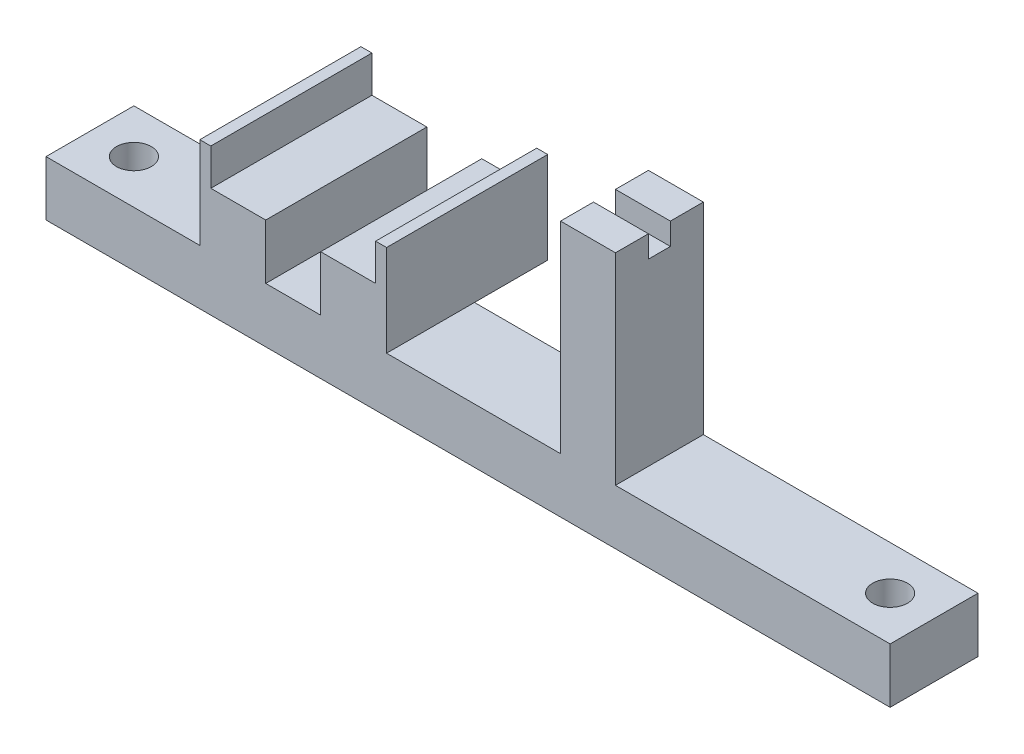
ISO-10303-21;
HEADER;
FILE_DESCRIPTION(('STEP AP214'),'2;1');
FILE_NAME('part.step','',(''),(''),'','','');
FILE_SCHEMA(('AUTOMOTIVE_DESIGN { 1 0 10303 214 1 1 1 1 }'));
ENDSEC;
DATA;
#1=APPLICATION_CONTEXT('core data for automotive mechanical design processes');
#2=APPLICATION_PROTOCOL_DEFINITION('international standard','automotive_design',2000,#1);
#3=PRODUCT_CONTEXT('',#1,'mechanical');
#4=PRODUCT('Part','Part','',(#3));
#5=PRODUCT_RELATED_PRODUCT_CATEGORY('part','',(#4));
#6=PRODUCT_DEFINITION_FORMATION('','',#4);
#7=PRODUCT_DEFINITION_CONTEXT('part definition',#1,'design');
#8=PRODUCT_DEFINITION('design','',#6,#7);
#9=PRODUCT_DEFINITION_SHAPE('','',#8);
#10=(LENGTH_UNIT() NAMED_UNIT(*) SI_UNIT(.MILLI.,.METRE.));
#11=(NAMED_UNIT(*) PLANE_ANGLE_UNIT() SI_UNIT($,.RADIAN.));
#12=(NAMED_UNIT(*) SI_UNIT($,.STERADIAN.) SOLID_ANGLE_UNIT());
#13=UNCERTAINTY_MEASURE_WITH_UNIT(LENGTH_MEASURE(1.E-05),#10,'distance_accuracy_value','');
#14=(GEOMETRIC_REPRESENTATION_CONTEXT(3) GLOBAL_UNCERTAINTY_ASSIGNED_CONTEXT((#13)) GLOBAL_UNIT_ASSIGNED_CONTEXT((#10,
#11,#12)) REPRESENTATION_CONTEXT('',''));
#15=CARTESIAN_POINT('',(0.,0.,0.));
#16=DIRECTION('',(0.,0.,1.));
#17=DIRECTION('',(1.,0.,0.));
#18=AXIS2_PLACEMENT_3D('',#15,#16,#17);
#19=CARTESIAN_POINT('',(0.,30.,0.));
#20=DIRECTION('',(0.,1.,0.));
#21=DIRECTION('',(0.,0.,1.));
#22=AXIS2_PLACEMENT_3D('',#19,#20,#21);
#23=PLANE('',#22);
#24=DIRECTION('',(1.,0.,0.));
#25=VECTOR('',#24,1.);
#26=CARTESIAN_POINT('',(-18.7314340588988,30.,-23.1962227912932));
#27=LINE('',#26,#25);
#28=CARTESIAN_POINT('',(-18.7314340588988,30.,-23.1962227912932));
#29=VERTEX_POINT('',#28);
#30=CARTESIAN_POINT('',(-3.73143405889884,30.,-23.1962227912932));
#31=VERTEX_POINT('',#30);
#32=EDGE_CURVE('E69',#29,#31,#27,.T.);
#33=ORIENTED_EDGE('',*,*,#32,.T.);
#34=DIRECTION('',(0.,0.,1.));
#35=VECTOR('',#34,1.);
#36=CARTESIAN_POINT('',(-3.73143405889885,30.,-67.1962227912932));
#37=LINE('',#36,#35);
#38=CARTESIAN_POINT('',(-3.73143405889885,30.,-67.1962227912932));
#39=VERTEX_POINT('',#38);
#40=EDGE_CURVE('E64',#39,#31,#37,.T.);
#41=ORIENTED_EDGE('',*,*,#40,.F.);
#42=DIRECTION('',(-1.,0.,0.));
#43=VECTOR('',#42,1.);
#44=CARTESIAN_POINT('',(-18.7314340588988,30.,-67.1962227912932));
#45=LINE('',#44,#43);
#46=CARTESIAN_POINT('',(-18.7314340588988,30.,-67.1962227912932));
#47=VERTEX_POINT('',#46);
#48=EDGE_CURVE('E416',#39,#47,#45,.T.);
#49=ORIENTED_EDGE('',*,*,#48,.T.);
#50=DIRECTION('',(0.,0.,1.));
#51=VECTOR('',#50,1.);
#52=CARTESIAN_POINT('',(-18.7314340588988,30.,-67.1962227912932));
#53=LINE('',#52,#51);
#54=EDGE_CURVE('E421',#47,#29,#53,.T.);
#55=ORIENTED_EDGE('',*,*,#54,.T.);
#56=EDGE_LOOP('',(#33,#41,#49,#55));
#57=FACE_BOUND('',#56,.T.);
#58=ADVANCED_FACE('F45',(#57),#23,.T.);
#59=CARTESIAN_POINT('',(0.,30.,0.));
#60=DIRECTION('',(0.,-1.,0.));
#61=DIRECTION('',(0.,0.,-1.));
#62=AXIS2_PLACEMENT_3D('',#59,#60,#61);
#63=PLANE('',#62);
#64=DIRECTION('',(0.,0.,-1.));
#65=VECTOR('',#64,1.);
#66=CARTESIAN_POINT('',(-48.7314340588988,30.,-67.1962227912932));
#67=LINE('',#66,#65);
#68=CARTESIAN_POINT('',(-48.7314340588988,30.,-23.1962227912932));
#69=VERTEX_POINT('',#68);
#70=CARTESIAN_POINT('',(-48.7314340588988,30.,-67.1962227912932));
#71=VERTEX_POINT('',#70);
#72=EDGE_CURVE('E248',#69,#71,#67,.T.);
#73=ORIENTED_EDGE('',*,*,#72,.F.);
#74=DIRECTION('',(1.,0.,0.));
#75=VECTOR('',#74,1.);
#76=CARTESIAN_POINT('',(-51.7314340588988,30.,-23.1962227912932));
#77=LINE('',#76,#75);
#78=CARTESIAN_POINT('',(-33.7314340588988,30.,-23.1962227912932));
#79=VERTEX_POINT('',#78);
#80=EDGE_CURVE('E372',#69,#79,#77,.T.);
#81=ORIENTED_EDGE('',*,*,#80,.T.);
#82=DIRECTION('',(0.,0.,-1.));
#83=VECTOR('',#82,1.);
#84=CARTESIAN_POINT('',(-33.7314340588988,30.,-23.1962227912932));
#85=LINE('',#84,#83);
#86=CARTESIAN_POINT('',(-33.7314340588988,30.,-67.1962227912932));
#87=VERTEX_POINT('',#86);
#88=EDGE_CURVE('E375',#79,#87,#85,.T.);
#89=ORIENTED_EDGE('',*,*,#88,.T.);
#90=DIRECTION('',(-1.,0.,0.));
#91=VECTOR('',#90,1.);
#92=CARTESIAN_POINT('',(-51.7314340588988,30.,-67.1962227912932));
#93=LINE('',#92,#91);
#94=EDGE_CURVE('E379',#87,#71,#93,.T.);
#95=ORIENTED_EDGE('',*,*,#94,.T.);
#96=EDGE_LOOP('',(#73,#81,#89,#95));
#97=FACE_BOUND('',#96,.T.);
#98=ADVANCED_FACE('F620',(#97),#63,.F.);
#99=CARTESIAN_POINT('',(0.,15.,0.));
#100=DIRECTION('',(0.,1.,0.));
#101=DIRECTION('',(0.,0.,1.));
#102=AXIS2_PLACEMENT_3D('',#99,#100,#101);
#103=PLANE('',#102);
#104=DIRECTION('',(1.,0.,0.));
#105=VECTOR('',#104,1.);
#106=CARTESIAN_POINT('',(-93.7314340588989,15.,-23.1962227912932));
#107=LINE('',#106,#105);
#108=CARTESIAN_POINT('',(-0.731434058898847,15.,-23.1962227912932));
#109=VERTEX_POINT('',#108);
#110=CARTESIAN_POINT('',(46.7685659411012,15.,-23.1962227912932));
#111=VERTEX_POINT('',#110);
#112=EDGE_CURVE('E551',#109,#111,#107,.T.);
#113=ORIENTED_EDGE('',*,*,#112,.T.);
#114=DIRECTION('',(0.,0.,1.));
#115=VECTOR('',#114,1.);
#116=CARTESIAN_POINT('',(46.7685659411012,15.,-47.1962227912932));
#117=LINE('',#116,#115);
#118=CARTESIAN_POINT('',(46.7685659411012,15.,-47.1962227912932));
#119=VERTEX_POINT('',#118);
#120=EDGE_CURVE('E317',#119,#111,#117,.T.);
#121=ORIENTED_EDGE('',*,*,#120,.F.);
#122=DIRECTION('',(-1.,0.,0.));
#123=VECTOR('',#122,1.);
#124=CARTESIAN_POINT('',(-93.7314340588988,15.,-47.1962227912932));
#125=LINE('',#124,#123);
#126=CARTESIAN_POINT('',(-0.731434058898849,15.,-47.1962227912932));
#127=VERTEX_POINT('',#126);
#128=EDGE_CURVE('E469',#119,#127,#125,.T.);
#129=ORIENTED_EDGE('',*,*,#128,.T.);
#130=DIRECTION('',(0.,0.,-1.));
#131=VECTOR('',#130,1.);
#132=CARTESIAN_POINT('',(-0.731434058898851,15.,-67.1962227912932));
#133=LINE('',#132,#131);
#134=EDGE_CURVE('E422',#109,#127,#133,.T.);
#135=ORIENTED_EDGE('',*,*,#134,.F.);
#136=EDGE_LOOP('',(#113,#121,#129,#135));
#137=FACE_BOUND('',#136,.T.);
#138=ADVANCED_FACE('F587',(#137),#103,.T.);
#139=CARTESIAN_POINT('',(124.768565941101,15.,-35.1962227912932));
#140=DIRECTION('',(0.,1.,0.));
#141=DIRECTION('',(0.,0.,1.));
#142=AXIS2_PLACEMENT_3D('',#139,#140,#141);
#143=CIRCLE('',#142,4.75000000000001);
#144=CARTESIAN_POINT('',(124.768565941101,15.,-30.4462227912932));
#145=VERTEX_POINT('',#144);
#146=EDGE_CURVE('E444',#145,#145,#143,.T.);
#147=ORIENTED_EDGE('',*,*,#146,.F.);
#148=EDGE_LOOP('',(#147));
#149=FACE_BOUND('',#148,.T.);
#150=CARTESIAN_POINT('',(136.768565941101,15.,-47.1962227912932));
#151=VERTEX_POINT('',#150);
#152=CARTESIAN_POINT('',(61.7685659411012,15.,-47.1962227912932));
#153=VERTEX_POINT('',#152);
#154=EDGE_CURVE('E465',#151,#153,#125,.T.);
#155=ORIENTED_EDGE('',*,*,#154,.T.);
#156=DIRECTION('',(0.,0.,-1.));
#157=VECTOR('',#156,1.);
#158=CARTESIAN_POINT('',(61.7685659411012,15.,-47.1962227912932));
#159=LINE('',#158,#157);
#160=CARTESIAN_POINT('',(61.7685659411012,15.,-23.1962227912932));
#161=VERTEX_POINT('',#160);
#162=EDGE_CURVE('E346',#161,#153,#159,.T.);
#163=ORIENTED_EDGE('',*,*,#162,.F.);
#164=CARTESIAN_POINT('',(136.768565941101,15.,-23.1962227912932));
#165=VERTEX_POINT('',#164);
#166=EDGE_CURVE('E455',#161,#165,#107,.T.);
#167=ORIENTED_EDGE('',*,*,#166,.T.);
#168=DIRECTION('',(0.,0.,-1.));
#169=VECTOR('',#168,1.);
#170=CARTESIAN_POINT('',(136.768565941101,15.,-47.1962227912932));
#171=LINE('',#170,#169);
#172=EDGE_CURVE('E460',#165,#151,#171,.T.);
#173=ORIENTED_EDGE('',*,*,#172,.T.);
#174=EDGE_LOOP('',(#155,#163,#167,#173));
#175=FACE_BOUND('',#174,.T.);
#176=ADVANCED_FACE('F549',(#149,#175),#103,.T.);
#177=DIRECTION('',(0.,0.,1.));
#178=VECTOR('',#177,1.);
#179=CARTESIAN_POINT('',(-51.7314340588988,15.,-23.1962227912932));
#180=LINE('',#179,#178);
#181=CARTESIAN_POINT('',(-51.7314340588988,15.,-47.1962227912932));
#182=VERTEX_POINT('',#181);
#183=CARTESIAN_POINT('',(-51.7314340588988,15.,-23.1962227912932));
#184=VERTEX_POINT('',#183);
#185=EDGE_CURVE('E11',#182,#184,#180,.T.);
#186=ORIENTED_EDGE('',*,*,#185,.F.);
#187=CARTESIAN_POINT('',(-93.7314340588988,15.,-47.1962227912932));
#188=VERTEX_POINT('',#187);
#189=EDGE_CURVE('E464',#182,#188,#125,.T.);
#190=ORIENTED_EDGE('',*,*,#189,.T.);
#191=DIRECTION('',(0.,0.,1.));
#192=VECTOR('',#191,1.);
#193=CARTESIAN_POINT('',(-93.7314340588988,15.,-47.1962227912932));
#194=LINE('',#193,#192);
#195=CARTESIAN_POINT('',(-93.7314340588989,15.,-23.1962227912932));
#196=VERTEX_POINT('',#195);
#197=EDGE_CURVE('E451',#188,#196,#194,.T.);
#198=ORIENTED_EDGE('',*,*,#197,.T.);
#199=EDGE_CURVE('E457',#196,#184,#107,.T.);
#200=ORIENTED_EDGE('',*,*,#199,.T.);
#201=EDGE_LOOP('',(#186,#190,#198,#200));
#202=FACE_BOUND('',#201,.T.);
#203=CARTESIAN_POINT('',(-81.7314340588989,15.,-35.1962227912932));
#204=DIRECTION('',(0.,1.,0.));
#205=DIRECTION('',(0.,0.,1.));
#206=AXIS2_PLACEMENT_3D('',#203,#204,#205);
#207=CIRCLE('',#206,4.75000000000001);
#208=CARTESIAN_POINT('',(-81.7314340588989,15.,-30.4462227912932));
#209=VERTEX_POINT('',#208);
#210=EDGE_CURVE('E440',#209,#209,#207,.T.);
#211=ORIENTED_EDGE('',*,*,#210,.F.);
#212=EDGE_LOOP('',(#211));
#213=FACE_BOUND('',#212,.T.);
#214=ADVANCED_FACE('F535',(#202,#213),#103,.T.);
#215=DIRECTION('',(0.,0.,-1.));
#216=VECTOR('',#215,1.);
#217=CARTESIAN_POINT('',(-33.7314340588988,15.,-23.1962227912932));
#218=LINE('',#217,#216);
#219=CARTESIAN_POINT('',(-33.7314340588988,15.,-23.1962227912932));
#220=VERTEX_POINT('',#219);
#221=CARTESIAN_POINT('',(-33.7314340588988,15.,-47.1962227912932));
#222=VERTEX_POINT('',#221);
#223=EDGE_CURVE('E386',#220,#222,#218,.T.);
#224=ORIENTED_EDGE('',*,*,#223,.F.);
#225=CARTESIAN_POINT('',(-18.7314340588988,15.,-23.1962227912932));
#226=VERTEX_POINT('',#225);
#227=EDGE_CURVE('E461',#220,#226,#107,.T.);
#228=ORIENTED_EDGE('',*,*,#227,.T.);
#229=DIRECTION('',(0.,0.,1.));
#230=VECTOR('',#229,1.);
#231=CARTESIAN_POINT('',(-18.7314340588988,15.,-67.1962227912932));
#232=LINE('',#231,#230);
#233=CARTESIAN_POINT('',(-18.7314340588988,15.,-47.1962227912932));
#234=VERTEX_POINT('',#233);
#235=EDGE_CURVE('E55',#234,#226,#232,.T.);
#236=ORIENTED_EDGE('',*,*,#235,.F.);
#237=EDGE_CURVE('E521',#234,#222,#125,.T.);
#238=ORIENTED_EDGE('',*,*,#237,.T.);
#239=EDGE_LOOP('',(#224,#228,#236,#238));
#240=FACE_BOUND('',#239,.T.);
#241=ADVANCED_FACE('F557',(#240),#103,.T.);
#242=CARTESIAN_POINT('',(-93.7314340588988,15.,-47.1962227912932));
#243=DIRECTION('',(1.,0.,0.));
#244=DIRECTION('',(0.,0.,-1.));
#245=AXIS2_PLACEMENT_3D('',#242,#243,#244);
#246=PLANE('',#245);
#247=DIRECTION('',(0.,0.,1.));
#248=VECTOR('',#247,1.);
#249=CARTESIAN_POINT('',(-93.7314340588988,0.,-47.1962227912932));
#250=LINE('',#249,#248);
#251=CARTESIAN_POINT('',(-93.7314340588988,0.,-47.1962227912932));
#252=VERTEX_POINT('',#251);
#253=CARTESIAN_POINT('',(-93.7314340588989,0.,-23.1962227912932));
#254=VERTEX_POINT('',#253);
#255=EDGE_CURVE('E439',#252,#254,#250,.T.);
#256=ORIENTED_EDGE('',*,*,#255,.T.);
#257=DIRECTION('',(0.,-1.,0.));
#258=VECTOR('',#257,1.);
#259=CARTESIAN_POINT('',(-93.7314340588989,15.,-23.1962227912932));
#260=LINE('',#259,#258);
#261=EDGE_CURVE('E49',#196,#254,#260,.T.);
#262=ORIENTED_EDGE('',*,*,#261,.F.);
#263=ORIENTED_EDGE('',*,*,#197,.F.);
#264=DIRECTION('',(0.,-1.,0.));
#265=VECTOR('',#264,1.);
#266=CARTESIAN_POINT('',(-93.7314340588988,15.,-47.1962227912932));
#267=LINE('',#266,#265);
#268=EDGE_CURVE('E468',#188,#252,#267,.T.);
#269=ORIENTED_EDGE('',*,*,#268,.T.);
#270=EDGE_LOOP('',(#256,#262,#263,#269));
#271=FACE_BOUND('',#270,.T.);
#272=ADVANCED_FACE('F47',(#271),#246,.F.);
#273=CARTESIAN_POINT('',(-93.7314340588989,15.,-23.1962227912932));
#274=DIRECTION('',(0.,0.,-1.));
#275=DIRECTION('',(-1.,0.,0.));
#276=AXIS2_PLACEMENT_3D('',#273,#274,#275);
#277=PLANE('',#276);
#278=DIRECTION('',(1.,0.,0.));
#279=VECTOR('',#278,1.);
#280=CARTESIAN_POINT('',(-93.7314340588989,0.,-23.1962227912932));
#281=LINE('',#280,#279);
#282=CARTESIAN_POINT('',(136.768565941101,0.,-23.1962227912932));
#283=VERTEX_POINT('',#282);
#284=EDGE_CURVE('E474',#254,#283,#281,.T.);
#285=ORIENTED_EDGE('',*,*,#284,.T.);
#286=DIRECTION('',(0.,-1.,0.));
#287=VECTOR('',#286,1.);
#288=CARTESIAN_POINT('',(136.768565941101,15.,-23.1962227912932));
#289=LINE('',#288,#287);
#290=EDGE_CURVE('E488',#165,#283,#289,.T.);
#291=ORIENTED_EDGE('',*,*,#290,.F.);
#292=ORIENTED_EDGE('',*,*,#166,.F.);
#293=DIRECTION('',(0.,-1.,0.));
#294=VECTOR('',#293,1.);
#295=CARTESIAN_POINT('',(61.7685659411012,64.,-23.1962227912932));
#296=LINE('',#295,#294);
#297=CARTESIAN_POINT('',(61.7685659411012,70.,-23.1962227912932));
#298=VERTEX_POINT('',#297);
#299=EDGE_CURVE('E363',#298,#161,#296,.T.);
#300=ORIENTED_EDGE('',*,*,#299,.F.);
#301=DIRECTION('',(1.,0.,0.));
#302=VECTOR('',#301,1.);
#303=CARTESIAN_POINT('',(46.7685659411012,70.,-23.1962227912932));
#304=LINE('',#303,#302);
#305=CARTESIAN_POINT('',(46.7685659411012,70.,-23.1962227912932));
#306=VERTEX_POINT('',#305);
#307=EDGE_CURVE('E335',#306,#298,#304,.T.);
#308=ORIENTED_EDGE('',*,*,#307,.F.);
#309=DIRECTION('',(0.,-1.,0.));
#310=VECTOR('',#309,1.);
#311=CARTESIAN_POINT('',(46.7685659411012,64.,-23.1962227912932));
#312=LINE('',#311,#310);
#313=EDGE_CURVE('E367',#306,#111,#312,.T.);
#314=ORIENTED_EDGE('',*,*,#313,.T.);
#315=ORIENTED_EDGE('',*,*,#112,.F.);
#316=DIRECTION('',(0.,-1.,0.));
#317=VECTOR('',#316,1.);
#318=CARTESIAN_POINT('',(-0.731434058898847,30.,-23.1962227912932));
#319=LINE('',#318,#317);
#320=CARTESIAN_POINT('',(-0.731434058898851,40.,-23.1962227912932));
#321=VERTEX_POINT('',#320);
#322=EDGE_CURVE('E404',#321,#109,#319,.T.);
#323=ORIENTED_EDGE('',*,*,#322,.F.);
#324=DIRECTION('',(1.,0.,0.));
#325=VECTOR('',#324,1.);
#326=CARTESIAN_POINT('',(-0.731434058898851,40.,-23.1962227912932));
#327=LINE('',#326,#325);
#328=CARTESIAN_POINT('',(-3.73143405889884,40.,-23.1962227912932));
#329=VERTEX_POINT('',#328);
#330=EDGE_CURVE('E273',#329,#321,#327,.T.);
#331=ORIENTED_EDGE('',*,*,#330,.F.);
#332=DIRECTION('',(0.,-1.,0.));
#333=VECTOR('',#332,1.);
#334=CARTESIAN_POINT('',(-3.73143405889884,40.,-23.1962227912932));
#335=LINE('',#334,#333);
#336=EDGE_CURVE('E269',#329,#31,#335,.T.);
#337=ORIENTED_EDGE('',*,*,#336,.T.);
#338=ORIENTED_EDGE('',*,*,#32,.F.);
#339=DIRECTION('',(0.,-1.,0.));
#340=VECTOR('',#339,1.);
#341=CARTESIAN_POINT('',(-18.7314340588988,30.,-23.1962227912932));
#342=LINE('',#341,#340);
#343=EDGE_CURVE('E371',#29,#226,#342,.T.);
#344=ORIENTED_EDGE('',*,*,#343,.T.);
#345=ORIENTED_EDGE('',*,*,#227,.F.);
#346=DIRECTION('',(0.,-1.,0.));
#347=VECTOR('',#346,1.);
#348=CARTESIAN_POINT('',(-33.7314340588988,30.,-23.1962227912932));
#349=LINE('',#348,#347);
#350=EDGE_CURVE('E230',#79,#220,#349,.T.);
#351=ORIENTED_EDGE('',*,*,#350,.F.);
#352=ORIENTED_EDGE('',*,*,#80,.F.);
#353=DIRECTION('',(0.,-1.,0.));
#354=VECTOR('',#353,1.);
#355=CARTESIAN_POINT('',(-48.7314340588988,40.,-23.1962227912932));
#356=LINE('',#355,#354);
#357=CARTESIAN_POINT('',(-48.7314340588988,40.,-23.1962227912932));
#358=VERTEX_POINT('',#357);
#359=EDGE_CURVE('E237',#358,#69,#356,.T.);
#360=ORIENTED_EDGE('',*,*,#359,.F.);
#361=DIRECTION('',(1.,0.,0.));
#362=VECTOR('',#361,1.);
#363=CARTESIAN_POINT('',(-51.7314340588988,40.,-23.1962227912932));
#364=LINE('',#363,#362);
#365=CARTESIAN_POINT('',(-51.7314340588988,40.,-23.1962227912932));
#366=VERTEX_POINT('',#365);
#367=EDGE_CURVE('E233',#366,#358,#364,.T.);
#368=ORIENTED_EDGE('',*,*,#367,.F.);
#369=DIRECTION('',(0.,-1.,0.));
#370=VECTOR('',#369,1.);
#371=CARTESIAN_POINT('',(-51.7314340588988,30.,-23.1962227912932));
#372=LINE('',#371,#370);
#373=EDGE_CURVE('E220',#366,#184,#372,.T.);
#374=ORIENTED_EDGE('',*,*,#373,.T.);
#375=ORIENTED_EDGE('',*,*,#199,.F.);
#376=ORIENTED_EDGE('',*,*,#261,.T.);
#377=EDGE_LOOP('',(#285,#291,#292,#300,#308,#314,#315,#323,#331,#337,#338,#344,#345,#351,#352,
#360,#368,#374,#375,#376));
#378=FACE_BOUND('',#377,.T.);
#379=ADVANCED_FACE('F234',(#378),#277,.F.);
#380=CARTESIAN_POINT('',(136.768565941101,15.,-47.1962227912932));
#381=DIRECTION('',(-1.,0.,0.));
#382=DIRECTION('',(0.,0.,1.));
#383=AXIS2_PLACEMENT_3D('',#380,#381,#382);
#384=PLANE('',#383);
#385=DIRECTION('',(0.,0.,-1.));
#386=VECTOR('',#385,1.);
#387=CARTESIAN_POINT('',(136.768565941101,0.,-47.1962227912932));
#388=LINE('',#387,#386);
#389=CARTESIAN_POINT('',(136.768565941101,0.,-47.1962227912932));
#390=VERTEX_POINT('',#389);
#391=EDGE_CURVE('E477',#283,#390,#388,.T.);
#392=ORIENTED_EDGE('',*,*,#391,.T.);
#393=DIRECTION('',(0.,-1.,0.));
#394=VECTOR('',#393,1.);
#395=CARTESIAN_POINT('',(136.768565941101,15.,-47.1962227912932));
#396=LINE('',#395,#394);
#397=EDGE_CURVE('E485',#151,#390,#396,.T.);
#398=ORIENTED_EDGE('',*,*,#397,.F.);
#399=ORIENTED_EDGE('',*,*,#172,.F.);
#400=ORIENTED_EDGE('',*,*,#290,.T.);
#401=EDGE_LOOP('',(#392,#398,#399,#400));
#402=FACE_BOUND('',#401,.T.);
#403=ADVANCED_FACE('F546',(#402),#384,.F.);
#404=CARTESIAN_POINT('',(-93.7314340588988,15.,-47.1962227912932));
#405=DIRECTION('',(0.,0.,1.));
#406=DIRECTION('',(1.,0.,0.));
#407=AXIS2_PLACEMENT_3D('',#404,#405,#406);
#408=PLANE('',#407);
#409=DIRECTION('',(-1.,0.,0.));
#410=VECTOR('',#409,1.);
#411=CARTESIAN_POINT('',(-93.7314340588988,0.,-47.1962227912932));
#412=LINE('',#411,#410);
#413=EDGE_CURVE('E456',#390,#252,#412,.T.);
#414=ORIENTED_EDGE('',*,*,#413,.T.);
#415=ORIENTED_EDGE('',*,*,#268,.F.);
#416=ORIENTED_EDGE('',*,*,#189,.F.);
#417=EDGE_CURVE('E524',#222,#182,#125,.T.);
#418=ORIENTED_EDGE('',*,*,#417,.F.);
#419=ORIENTED_EDGE('',*,*,#237,.F.);
#420=EDGE_CURVE('E470',#127,#234,#125,.T.);
#421=ORIENTED_EDGE('',*,*,#420,.F.);
#422=ORIENTED_EDGE('',*,*,#128,.F.);
#423=DIRECTION('',(0.,-1.,0.));
#424=VECTOR('',#423,1.);
#425=CARTESIAN_POINT('',(46.7685659411012,64.,-47.1962227912932));
#426=LINE('',#425,#424);
#427=CARTESIAN_POINT('',(46.7685659411012,70.,-47.1962227912932));
#428=VERTEX_POINT('',#427);
#429=EDGE_CURVE('E349',#428,#119,#426,.T.);
#430=ORIENTED_EDGE('',*,*,#429,.F.);
#431=DIRECTION('',(-1.,0.,0.));
#432=VECTOR('',#431,1.);
#433=CARTESIAN_POINT('',(46.7685659411012,70.,-47.1962227912932));
#434=LINE('',#433,#432);
#435=CARTESIAN_POINT('',(61.7685659411012,70.,-47.1962227912932));
#436=VERTEX_POINT('',#435);
#437=EDGE_CURVE('E301',#436,#428,#434,.T.);
#438=ORIENTED_EDGE('',*,*,#437,.F.);
#439=DIRECTION('',(0.,-1.,0.));
#440=VECTOR('',#439,1.);
#441=CARTESIAN_POINT('',(61.7685659411012,64.,-47.1962227912932));
#442=LINE('',#441,#440);
#443=EDGE_CURVE('E359',#436,#153,#442,.T.);
#444=ORIENTED_EDGE('',*,*,#443,.T.);
#445=ORIENTED_EDGE('',*,*,#154,.F.);
#446=ORIENTED_EDGE('',*,*,#397,.T.);
#447=EDGE_LOOP('',(#414,#415,#416,#418,#419,#421,#422,#430,#438,#444,#445,#446));
#448=FACE_BOUND('',#447,.T.);
#449=ADVANCED_FACE('F538',(#448),#408,.F.);
#450=CARTESIAN_POINT('',(0.,0.,0.));
#451=DIRECTION('',(0.,1.,0.));
#452=DIRECTION('',(0.,0.,1.));
#453=AXIS2_PLACEMENT_3D('',#450,#451,#452);
#454=PLANE('',#453);
#455=CARTESIAN_POINT('',(-81.7314340588989,0.,-35.1962227912932));
#456=DIRECTION('',(0.,1.,0.));
#457=DIRECTION('',(0.,0.,1.));
#458=AXIS2_PLACEMENT_3D('',#455,#456,#457);
#459=CIRCLE('',#458,4.75000000000001);
#460=CARTESIAN_POINT('',(-81.7314340588989,0.,-30.4462227912932));
#461=VERTEX_POINT('',#460);
#462=EDGE_CURVE('E435',#461,#461,#459,.T.);
#463=ORIENTED_EDGE('',*,*,#462,.T.);
#464=EDGE_LOOP('',(#463));
#465=FACE_BOUND('',#464,.T.);
#466=CARTESIAN_POINT('',(124.768565941101,0.,-35.1962227912932));
#467=DIRECTION('',(0.,1.,0.));
#468=DIRECTION('',(0.,0.,1.));
#469=AXIS2_PLACEMENT_3D('',#466,#467,#468);
#470=CIRCLE('',#469,4.75000000000001);
#471=CARTESIAN_POINT('',(124.768565941101,0.,-30.4462227912932));
#472=VERTEX_POINT('',#471);
#473=EDGE_CURVE('E229',#472,#472,#470,.T.);
#474=ORIENTED_EDGE('',*,*,#473,.T.);
#475=EDGE_LOOP('',(#474));
#476=FACE_BOUND('',#475,.T.);
#477=ORIENTED_EDGE('',*,*,#255,.F.);
#478=ORIENTED_EDGE('',*,*,#413,.F.);
#479=ORIENTED_EDGE('',*,*,#391,.F.);
#480=ORIENTED_EDGE('',*,*,#284,.F.);
#481=EDGE_LOOP('',(#477,#478,#479,#480));
#482=FACE_BOUND('',#481,.T.);
#483=ADVANCED_FACE('F543',(#465,#476,#482),#454,.F.);
#484=CARTESIAN_POINT('',(124.768565941101,0.,-35.1962227912932));
#485=DIRECTION('',(0.,1.,0.));
#486=DIRECTION('',(0.,0.,1.));
#487=AXIS2_PLACEMENT_3D('',#484,#485,#486);
#488=CYLINDRICAL_SURFACE('',#487,4.75000000000001);
#489=ORIENTED_EDGE('',*,*,#473,.F.);
#490=EDGE_LOOP('',(#489));
#491=FACE_BOUND('',#490,.T.);
#492=ORIENTED_EDGE('',*,*,#146,.T.);
#493=EDGE_LOOP('',(#492));
#494=FACE_BOUND('',#493,.T.);
#495=ADVANCED_FACE('F633',(#491,#494),#488,.F.);
#496=CARTESIAN_POINT('',(-81.7314340588989,0.,-35.1962227912932));
#497=DIRECTION('',(0.,1.,0.));
#498=DIRECTION('',(0.,0.,1.));
#499=AXIS2_PLACEMENT_3D('',#496,#497,#498);
#500=CYLINDRICAL_SURFACE('',#499,4.75000000000001);
#501=ORIENTED_EDGE('',*,*,#462,.F.);
#502=EDGE_LOOP('',(#501));
#503=FACE_BOUND('',#502,.T.);
#504=ORIENTED_EDGE('',*,*,#210,.T.);
#505=EDGE_LOOP('',(#504));
#506=FACE_BOUND('',#505,.T.);
#507=ADVANCED_FACE('F630',(#503,#506),#500,.F.);
#508=CARTESIAN_POINT('',(0.,15.,0.));
#509=DIRECTION('',(0.,1.,0.));
#510=DIRECTION('',(0.,0.,1.));
#511=AXIS2_PLACEMENT_3D('',#508,#509,#510);
#512=PLANE('',#511);
#513=CARTESIAN_POINT('',(-0.731434058898851,15.,-67.1962227912932));
#514=VERTEX_POINT('',#513);
#515=EDGE_CURVE('E420',#127,#514,#133,.T.);
#516=ORIENTED_EDGE('',*,*,#515,.F.);
#517=ORIENTED_EDGE('',*,*,#420,.T.);
#518=CARTESIAN_POINT('',(-18.7314340588988,15.,-67.1962227912932));
#519=VERTEX_POINT('',#518);
#520=EDGE_CURVE('E385',#519,#234,#232,.T.);
#521=ORIENTED_EDGE('',*,*,#520,.F.);
#522=DIRECTION('',(-1.,0.,0.));
#523=VECTOR('',#522,1.);
#524=CARTESIAN_POINT('',(-18.7314340588988,15.,-67.1962227912932));
#525=LINE('',#524,#523);
#526=EDGE_CURVE('E417',#514,#519,#525,.T.);
#527=ORIENTED_EDGE('',*,*,#526,.F.);
#528=EDGE_LOOP('',(#516,#517,#521,#527));
#529=FACE_BOUND('',#528,.T.);
#530=ADVANCED_FACE('F517',(#529),#512,.F.);
#531=CARTESIAN_POINT('',(-18.7314340588988,30.,-67.1962227912932));
#532=DIRECTION('',(1.,0.,0.));
#533=DIRECTION('',(0.,0.,-1.));
#534=AXIS2_PLACEMENT_3D('',#531,#532,#533);
#535=PLANE('',#534);
#536=ORIENTED_EDGE('',*,*,#520,.T.);
#537=ORIENTED_EDGE('',*,*,#235,.T.);
#538=ORIENTED_EDGE('',*,*,#343,.F.);
#539=ORIENTED_EDGE('',*,*,#54,.F.);
#540=DIRECTION('',(0.,-1.,0.));
#541=VECTOR('',#540,1.);
#542=CARTESIAN_POINT('',(-18.7314340588988,30.,-67.1962227912932));
#543=LINE('',#542,#541);
#544=EDGE_CURVE('E412',#47,#519,#543,.T.);
#545=ORIENTED_EDGE('',*,*,#544,.T.);
#546=EDGE_LOOP('',(#536,#537,#538,#539,#545));
#547=FACE_BOUND('',#546,.T.);
#548=ADVANCED_FACE('F502',(#547),#535,.F.);
#549=CARTESIAN_POINT('',(-0.731434058898851,30.,-67.1962227912932));
#550=DIRECTION('',(-1.,0.,0.));
#551=DIRECTION('',(0.,0.,1.));
#552=AXIS2_PLACEMENT_3D('',#549,#550,#551);
#553=PLANE('',#552);
#554=ORIENTED_EDGE('',*,*,#134,.T.);
#555=ORIENTED_EDGE('',*,*,#515,.T.);
#556=DIRECTION('',(0.,-1.,0.));
#557=VECTOR('',#556,1.);
#558=CARTESIAN_POINT('',(-0.731434058898851,30.,-67.1962227912932));
#559=LINE('',#558,#557);
#560=CARTESIAN_POINT('',(-0.731434058898851,40.,-67.1962227912932));
#561=VERTEX_POINT('',#560);
#562=EDGE_CURVE('E408',#561,#514,#559,.T.);
#563=ORIENTED_EDGE('',*,*,#562,.F.);
#564=DIRECTION('',(0.,0.,-1.));
#565=VECTOR('',#564,1.);
#566=CARTESIAN_POINT('',(-0.731434058898851,40.,-67.1962227912932));
#567=LINE('',#566,#565);
#568=EDGE_CURVE('E276',#321,#561,#567,.T.);
#569=ORIENTED_EDGE('',*,*,#568,.F.);
#570=ORIENTED_EDGE('',*,*,#322,.T.);
#571=EDGE_LOOP('',(#554,#555,#563,#569,#570));
#572=FACE_BOUND('',#571,.T.);
#573=ADVANCED_FACE('F574',(#572),#553,.F.);
#574=CARTESIAN_POINT('',(-18.7314340588988,30.,-67.1962227912932));
#575=DIRECTION('',(0.,0.,1.));
#576=DIRECTION('',(1.,0.,0.));
#577=AXIS2_PLACEMENT_3D('',#574,#575,#576);
#578=PLANE('',#577);
#579=ORIENTED_EDGE('',*,*,#526,.T.);
#580=ORIENTED_EDGE('',*,*,#544,.F.);
#581=ORIENTED_EDGE('',*,*,#48,.F.);
#582=DIRECTION('',(0.,-1.,0.));
#583=VECTOR('',#582,1.);
#584=CARTESIAN_POINT('',(-3.73143405889885,40.,-67.1962227912932));
#585=LINE('',#584,#583);
#586=CARTESIAN_POINT('',(-3.73143405889885,40.,-67.1962227912932));
#587=VERTEX_POINT('',#586);
#588=EDGE_CURVE('E265',#587,#39,#585,.T.);
#589=ORIENTED_EDGE('',*,*,#588,.F.);
#590=DIRECTION('',(-1.,0.,0.));
#591=VECTOR('',#590,1.);
#592=CARTESIAN_POINT('',(-0.731434058898851,40.,-67.1962227912932));
#593=LINE('',#592,#591);
#594=EDGE_CURVE('E283',#561,#587,#593,.T.);
#595=ORIENTED_EDGE('',*,*,#594,.F.);
#596=ORIENTED_EDGE('',*,*,#562,.T.);
#597=EDGE_LOOP('',(#579,#580,#581,#589,#595,#596));
#598=FACE_BOUND('',#597,.T.);
#599=ADVANCED_FACE('F577',(#598),#578,.F.);
#600=CARTESIAN_POINT('',(-51.7314340588988,30.,-23.1962227912932));
#601=DIRECTION('',(1.,0.,0.));
#602=DIRECTION('',(0.,0.,-1.));
#603=AXIS2_PLACEMENT_3D('',#600,#601,#602);
#604=PLANE('',#603);
#605=CARTESIAN_POINT('',(-51.7314340588988,15.,-67.1962227912932));
#606=VERTEX_POINT('',#605);
#607=EDGE_CURVE('E57',#606,#182,#180,.T.);
#608=ORIENTED_EDGE('',*,*,#607,.T.);
#609=ORIENTED_EDGE('',*,*,#185,.T.);
#610=ORIENTED_EDGE('',*,*,#373,.F.);
#611=DIRECTION('',(0.,0.,1.));
#612=VECTOR('',#611,1.);
#613=CARTESIAN_POINT('',(-51.7314340588988,40.,-67.1962227912932));
#614=LINE('',#613,#612);
#615=CARTESIAN_POINT('',(-51.7314340588988,40.,-67.1962227912932));
#616=VERTEX_POINT('',#615);
#617=EDGE_CURVE('E226',#616,#366,#614,.T.);
#618=ORIENTED_EDGE('',*,*,#617,.F.);
#619=DIRECTION('',(0.,-1.,0.));
#620=VECTOR('',#619,1.);
#621=CARTESIAN_POINT('',(-51.7314340588988,30.,-67.1962227912932));
#622=LINE('',#621,#620);
#623=EDGE_CURVE('E381',#616,#606,#622,.T.);
#624=ORIENTED_EDGE('',*,*,#623,.T.);
#625=EDGE_LOOP('',(#608,#609,#610,#618,#624));
#626=FACE_BOUND('',#625,.T.);
#627=ADVANCED_FACE('F223',(#626),#604,.F.);
#628=CARTESIAN_POINT('',(-33.7314340588988,30.,-23.1962227912932));
#629=DIRECTION('',(-1.,0.,0.));
#630=DIRECTION('',(0.,0.,1.));
#631=AXIS2_PLACEMENT_3D('',#628,#629,#630);
#632=PLANE('',#631);
#633=ORIENTED_EDGE('',*,*,#223,.T.);
#634=CARTESIAN_POINT('',(-33.7314340588988,15.,-67.1962227912932));
#635=VERTEX_POINT('',#634);
#636=EDGE_CURVE('E384',#222,#635,#218,.T.);
#637=ORIENTED_EDGE('',*,*,#636,.T.);
#638=DIRECTION('',(0.,-1.,0.));
#639=VECTOR('',#638,1.);
#640=CARTESIAN_POINT('',(-33.7314340588988,30.,-67.1962227912932));
#641=LINE('',#640,#639);
#642=EDGE_CURVE('E394',#87,#635,#641,.T.);
#643=ORIENTED_EDGE('',*,*,#642,.F.);
#644=ORIENTED_EDGE('',*,*,#88,.F.);
#645=ORIENTED_EDGE('',*,*,#350,.T.);
#646=EDGE_LOOP('',(#633,#637,#643,#644,#645));
#647=FACE_BOUND('',#646,.T.);
#648=ADVANCED_FACE('F559',(#647),#632,.F.);
#649=CARTESIAN_POINT('',(-51.7314340588988,30.,-67.1962227912932));
#650=DIRECTION('',(0.,0.,1.));
#651=DIRECTION('',(1.,0.,0.));
#652=AXIS2_PLACEMENT_3D('',#649,#650,#651);
#653=PLANE('',#652);
#654=DIRECTION('',(-1.,0.,0.));
#655=VECTOR('',#654,1.);
#656=CARTESIAN_POINT('',(-51.7314340588988,15.,-67.1962227912932));
#657=LINE('',#656,#655);
#658=EDGE_CURVE('E376',#635,#606,#657,.T.);
#659=ORIENTED_EDGE('',*,*,#658,.T.);
#660=ORIENTED_EDGE('',*,*,#623,.F.);
#661=DIRECTION('',(-1.,0.,0.));
#662=VECTOR('',#661,1.);
#663=CARTESIAN_POINT('',(-51.7314340588988,40.,-67.1962227912932));
#664=LINE('',#663,#662);
#665=CARTESIAN_POINT('',(-48.7314340588988,40.,-67.1962227912932));
#666=VERTEX_POINT('',#665);
#667=EDGE_CURVE('E246',#666,#616,#664,.T.);
#668=ORIENTED_EDGE('',*,*,#667,.F.);
#669=DIRECTION('',(0.,-1.,0.));
#670=VECTOR('',#669,1.);
#671=CARTESIAN_POINT('',(-48.7314340588988,40.,-67.1962227912932));
#672=LINE('',#671,#670);
#673=EDGE_CURVE('E257',#666,#71,#672,.T.);
#674=ORIENTED_EDGE('',*,*,#673,.T.);
#675=ORIENTED_EDGE('',*,*,#94,.F.);
#676=ORIENTED_EDGE('',*,*,#642,.T.);
#677=EDGE_LOOP('',(#659,#660,#668,#674,#675,#676));
#678=FACE_BOUND('',#677,.T.);
#679=ADVANCED_FACE('F568',(#678),#653,.F.);
#680=CARTESIAN_POINT('',(0.,15.,0.));
#681=DIRECTION('',(0.,-1.,0.));
#682=DIRECTION('',(0.,0.,-1.));
#683=AXIS2_PLACEMENT_3D('',#680,#681,#682);
#684=PLANE('',#683);
#685=ORIENTED_EDGE('',*,*,#636,.F.);
#686=ORIENTED_EDGE('',*,*,#417,.T.);
#687=ORIENTED_EDGE('',*,*,#607,.F.);
#688=ORIENTED_EDGE('',*,*,#658,.F.);
#689=EDGE_LOOP('',(#685,#686,#687,#688));
#690=FACE_BOUND('',#689,.T.);
#691=ADVANCED_FACE('F570',(#690),#684,.T.);
#692=CARTESIAN_POINT('',(46.7685659411012,64.,-47.1962227912932));
#693=DIRECTION('',(1.,0.,0.));
#694=DIRECTION('',(0.,0.,-1.));
#695=AXIS2_PLACEMENT_3D('',#692,#693,#694);
#696=PLANE('',#695);
#697=ORIENTED_EDGE('',*,*,#120,.T.);
#698=ORIENTED_EDGE('',*,*,#313,.F.);
#699=DIRECTION('',(0.,0.,1.));
#700=VECTOR('',#699,1.);
#701=CARTESIAN_POINT('',(46.7685659411012,70.,-23.1962227912932));
#702=LINE('',#701,#700);
#703=CARTESIAN_POINT('',(46.7685659411012,70.,-32.1962227912932));
#704=VERTEX_POINT('',#703);
#705=EDGE_CURVE('E329',#704,#306,#702,.T.);
#706=ORIENTED_EDGE('',*,*,#705,.F.);
#707=DIRECTION('',(0.,-1.,0.));
#708=VECTOR('',#707,1.);
#709=CARTESIAN_POINT('',(46.7685659411012,70.,-32.1962227912932));
#710=LINE('',#709,#708);
#711=CARTESIAN_POINT('',(46.7685659411012,64.,-32.1962227912932));
#712=VERTEX_POINT('',#711);
#713=EDGE_CURVE('E321',#704,#712,#710,.T.);
#714=ORIENTED_EDGE('',*,*,#713,.T.);
#715=DIRECTION('',(0.,0.,1.));
#716=VECTOR('',#715,1.);
#717=CARTESIAN_POINT('',(46.7685659411012,64.,-47.1962227912932));
#718=LINE('',#717,#716);
#719=CARTESIAN_POINT('',(46.7685659411012,64.,-38.1962227912932));
#720=VERTEX_POINT('',#719);
#721=EDGE_CURVE('E342',#720,#712,#718,.T.);
#722=ORIENTED_EDGE('',*,*,#721,.F.);
#723=DIRECTION('',(0.,-1.,0.));
#724=VECTOR('',#723,1.);
#725=CARTESIAN_POINT('',(46.7685659411012,70.,-38.1962227912932));
#726=LINE('',#725,#724);
#727=CARTESIAN_POINT('',(46.7685659411012,70.,-38.1962227912932));
#728=VERTEX_POINT('',#727);
#729=EDGE_CURVE('E313',#728,#720,#726,.T.);
#730=ORIENTED_EDGE('',*,*,#729,.F.);
#731=DIRECTION('',(0.,0.,1.));
#732=VECTOR('',#731,1.);
#733=CARTESIAN_POINT('',(46.7685659411012,70.,-47.1962227912932));
#734=LINE('',#733,#732);
#735=EDGE_CURVE('E289',#428,#728,#734,.T.);
#736=ORIENTED_EDGE('',*,*,#735,.F.);
#737=ORIENTED_EDGE('',*,*,#429,.T.);
#738=EDGE_LOOP('',(#697,#698,#706,#714,#722,#730,#736,#737));
#739=FACE_BOUND('',#738,.T.);
#740=ADVANCED_FACE('F585',(#739),#696,.F.);
#741=CARTESIAN_POINT('',(61.7685659411012,64.,-47.1962227912932));
#742=DIRECTION('',(-1.,0.,0.));
#743=DIRECTION('',(0.,0.,1.));
#744=AXIS2_PLACEMENT_3D('',#741,#742,#743);
#745=PLANE('',#744);
#746=ORIENTED_EDGE('',*,*,#162,.T.);
#747=ORIENTED_EDGE('',*,*,#443,.F.);
#748=DIRECTION('',(0.,0.,-1.));
#749=VECTOR('',#748,1.);
#750=CARTESIAN_POINT('',(61.7685659411012,70.,-47.1962227912932));
#751=LINE('',#750,#749);
#752=CARTESIAN_POINT('',(61.7685659411012,70.,-38.1962227912932));
#753=VERTEX_POINT('',#752);
#754=EDGE_CURVE('E297',#753,#436,#751,.T.);
#755=ORIENTED_EDGE('',*,*,#754,.F.);
#756=DIRECTION('',(0.,-1.,0.));
#757=VECTOR('',#756,1.);
#758=CARTESIAN_POINT('',(61.7685659411012,70.,-38.1962227912932));
#759=LINE('',#758,#757);
#760=CARTESIAN_POINT('',(61.7685659411012,64.,-38.1962227912932));
#761=VERTEX_POINT('',#760);
#762=EDGE_CURVE('E305',#753,#761,#759,.T.);
#763=ORIENTED_EDGE('',*,*,#762,.T.);
#764=DIRECTION('',(0.,0.,-1.));
#765=VECTOR('',#764,1.);
#766=CARTESIAN_POINT('',(61.7685659411012,64.,-47.1962227912932));
#767=LINE('',#766,#765);
#768=CARTESIAN_POINT('',(61.7685659411012,64.,-32.1962227912932));
#769=VERTEX_POINT('',#768);
#770=EDGE_CURVE('E345',#769,#761,#767,.T.);
#771=ORIENTED_EDGE('',*,*,#770,.F.);
#772=DIRECTION('',(0.,-1.,0.));
#773=VECTOR('',#772,1.);
#774=CARTESIAN_POINT('',(61.7685659411012,70.,-32.1962227912932));
#775=LINE('',#774,#773);
#776=CARTESIAN_POINT('',(61.7685659411012,70.,-32.1962227912932));
#777=VERTEX_POINT('',#776);
#778=EDGE_CURVE('E264',#777,#769,#775,.T.);
#779=ORIENTED_EDGE('',*,*,#778,.F.);
#780=DIRECTION('',(0.,0.,-1.));
#781=VECTOR('',#780,1.);
#782=CARTESIAN_POINT('',(61.7685659411012,70.,-23.1962227912932));
#783=LINE('',#782,#781);
#784=EDGE_CURVE('E332',#298,#777,#783,.T.);
#785=ORIENTED_EDGE('',*,*,#784,.F.);
#786=ORIENTED_EDGE('',*,*,#299,.T.);
#787=EDGE_LOOP('',(#746,#747,#755,#763,#771,#779,#785,#786));
#788=FACE_BOUND('',#787,.T.);
#789=ADVANCED_FACE('F599',(#788),#745,.F.);
#790=CARTESIAN_POINT('',(0.,64.,0.));
#791=DIRECTION('',(0.,1.,0.));
#792=DIRECTION('',(0.,0.,1.));
#793=AXIS2_PLACEMENT_3D('',#790,#791,#792);
#794=PLANE('',#793);
#795=DIRECTION('',(1.,0.,0.));
#796=VECTOR('',#795,1.);
#797=CARTESIAN_POINT('',(46.7685659411012,64.,-38.1962227912932));
#798=LINE('',#797,#796);
#799=EDGE_CURVE('E294',#720,#761,#798,.T.);
#800=ORIENTED_EDGE('',*,*,#799,.F.);
#801=ORIENTED_EDGE('',*,*,#721,.T.);
#802=DIRECTION('',(-1.,0.,0.));
#803=VECTOR('',#802,1.);
#804=CARTESIAN_POINT('',(46.7685659411012,64.,-32.1962227912932));
#805=LINE('',#804,#803);
#806=EDGE_CURVE('E309',#769,#712,#805,.T.);
#807=ORIENTED_EDGE('',*,*,#806,.F.);
#808=ORIENTED_EDGE('',*,*,#770,.T.);
#809=EDGE_LOOP('',(#800,#801,#807,#808));
#810=FACE_BOUND('',#809,.T.);
#811=ADVANCED_FACE('F609',(#810),#794,.T.);
#812=CARTESIAN_POINT('',(46.7685659411012,70.,-32.1962227912932));
#813=DIRECTION('',(0.,0.,1.));
#814=DIRECTION('',(1.,0.,0.));
#815=AXIS2_PLACEMENT_3D('',#812,#813,#814);
#816=PLANE('',#815);
#817=ORIENTED_EDGE('',*,*,#806,.T.);
#818=ORIENTED_EDGE('',*,*,#713,.F.);
#819=DIRECTION('',(-1.,0.,0.));
#820=VECTOR('',#819,1.);
#821=CARTESIAN_POINT('',(46.7685659411012,70.,-32.1962227912932));
#822=LINE('',#821,#820);
#823=EDGE_CURVE('E325',#777,#704,#822,.T.);
#824=ORIENTED_EDGE('',*,*,#823,.F.);
#825=ORIENTED_EDGE('',*,*,#778,.T.);
#826=EDGE_LOOP('',(#817,#818,#824,#825));
#827=FACE_BOUND('',#826,.T.);
#828=ADVANCED_FACE('F607',(#827),#816,.F.);
#829=CARTESIAN_POINT('',(0.,70.,0.));
#830=DIRECTION('',(0.,-1.,0.));
#831=DIRECTION('',(0.,0.,-1.));
#832=AXIS2_PLACEMENT_3D('',#829,#830,#831);
#833=PLANE('',#832);
#834=ORIENTED_EDGE('',*,*,#705,.T.);
#835=ORIENTED_EDGE('',*,*,#307,.T.);
#836=ORIENTED_EDGE('',*,*,#784,.T.);
#837=ORIENTED_EDGE('',*,*,#823,.T.);
#838=EDGE_LOOP('',(#834,#835,#836,#837));
#839=FACE_BOUND('',#838,.T.);
#840=ADVANCED_FACE('F603',(#839),#833,.F.);
#841=CARTESIAN_POINT('',(46.7685659411012,70.,-38.1962227912932));
#842=DIRECTION('',(0.,0.,-1.));
#843=DIRECTION('',(-1.,0.,0.));
#844=AXIS2_PLACEMENT_3D('',#841,#842,#843);
#845=PLANE('',#844);
#846=ORIENTED_EDGE('',*,*,#799,.T.);
#847=ORIENTED_EDGE('',*,*,#762,.F.);
#848=DIRECTION('',(1.,0.,0.));
#849=VECTOR('',#848,1.);
#850=CARTESIAN_POINT('',(46.7685659411012,70.,-38.1962227912932));
#851=LINE('',#850,#849);
#852=EDGE_CURVE('E293',#728,#753,#851,.T.);
#853=ORIENTED_EDGE('',*,*,#852,.F.);
#854=ORIENTED_EDGE('',*,*,#729,.T.);
#855=EDGE_LOOP('',(#846,#847,#853,#854));
#856=FACE_BOUND('',#855,.T.);
#857=ADVANCED_FACE('F595',(#856),#845,.F.);
#858=CARTESIAN_POINT('',(0.,70.,0.));
#859=DIRECTION('',(0.,1.,0.));
#860=DIRECTION('',(0.,0.,1.));
#861=AXIS2_PLACEMENT_3D('',#858,#859,#860);
#862=PLANE('',#861);
#863=ORIENTED_EDGE('',*,*,#735,.T.);
#864=ORIENTED_EDGE('',*,*,#852,.T.);
#865=ORIENTED_EDGE('',*,*,#754,.T.);
#866=ORIENTED_EDGE('',*,*,#437,.T.);
#867=EDGE_LOOP('',(#863,#864,#865,#866));
#868=FACE_BOUND('',#867,.T.);
#869=ADVANCED_FACE('F590',(#868),#862,.T.);
#870=CARTESIAN_POINT('',(-48.7314340588988,40.,-67.1962227912932));
#871=DIRECTION('',(-1.,0.,0.));
#872=DIRECTION('',(0.,0.,1.));
#873=AXIS2_PLACEMENT_3D('',#870,#871,#872);
#874=PLANE('',#873);
#875=ORIENTED_EDGE('',*,*,#72,.T.);
#876=ORIENTED_EDGE('',*,*,#673,.F.);
#877=DIRECTION('',(0.,0.,-1.));
#878=VECTOR('',#877,1.);
#879=CARTESIAN_POINT('',(-48.7314340588988,40.,-67.1962227912932));
#880=LINE('',#879,#878);
#881=EDGE_CURVE('E241',#358,#666,#880,.T.);
#882=ORIENTED_EDGE('',*,*,#881,.F.);
#883=ORIENTED_EDGE('',*,*,#359,.T.);
#884=EDGE_LOOP('',(#875,#876,#882,#883));
#885=FACE_BOUND('',#884,.T.);
#886=ADVANCED_FACE('F564',(#885),#874,.F.);
#887=CARTESIAN_POINT('',(0.,40.,0.));
#888=DIRECTION('',(0.,1.,0.));
#889=DIRECTION('',(0.,0.,1.));
#890=AXIS2_PLACEMENT_3D('',#887,#888,#889);
#891=PLANE('',#890);
#892=ORIENTED_EDGE('',*,*,#617,.T.);
#893=ORIENTED_EDGE('',*,*,#367,.T.);
#894=ORIENTED_EDGE('',*,*,#881,.T.);
#895=ORIENTED_EDGE('',*,*,#667,.T.);
#896=EDGE_LOOP('',(#892,#893,#894,#895));
#897=FACE_BOUND('',#896,.T.);
#898=ADVANCED_FACE('F244',(#897),#891,.T.);
#899=CARTESIAN_POINT('',(-3.73143405889885,40.,-67.1962227912932));
#900=DIRECTION('',(1.,0.,0.));
#901=DIRECTION('',(0.,0.,-1.));
#902=AXIS2_PLACEMENT_3D('',#899,#900,#901);
#903=PLANE('',#902);
#904=ORIENTED_EDGE('',*,*,#40,.T.);
#905=ORIENTED_EDGE('',*,*,#336,.F.);
#906=DIRECTION('',(0.,0.,1.));
#907=VECTOR('',#906,1.);
#908=CARTESIAN_POINT('',(-3.73143405889885,40.,-67.1962227912932));
#909=LINE('',#908,#907);
#910=EDGE_CURVE('E280',#587,#329,#909,.T.);
#911=ORIENTED_EDGE('',*,*,#910,.F.);
#912=ORIENTED_EDGE('',*,*,#588,.T.);
#913=EDGE_LOOP('',(#904,#905,#911,#912));
#914=FACE_BOUND('',#913,.T.);
#915=ADVANCED_FACE('F794',(#914),#903,.F.);
#916=CARTESIAN_POINT('',(0.,40.,0.));
#917=DIRECTION('',(0.,-1.,0.));
#918=DIRECTION('',(0.,0.,-1.));
#919=AXIS2_PLACEMENT_3D('',#916,#917,#918);
#920=PLANE('',#919);
#921=ORIENTED_EDGE('',*,*,#568,.T.);
#922=ORIENTED_EDGE('',*,*,#594,.T.);
#923=ORIENTED_EDGE('',*,*,#910,.T.);
#924=ORIENTED_EDGE('',*,*,#330,.T.);
#925=EDGE_LOOP('',(#921,#922,#923,#924));
#926=FACE_BOUND('',#925,.T.);
#927=ADVANCED_FACE('F581',(#926),#920,.F.);
#928=CLOSED_SHELL('',(#58,#98,#138,#176,#214,#241,#272,#379,#403,#449,#483,#495,#507,#530,#548,
#573,#599,#627,#648,#679,#691,#740,#789,#811,#828,#840,#857,#869,#886,#898,#915,#927));
#929=MANIFOLD_SOLID_BREP('B2',#928);
#930=ADVANCED_BREP_SHAPE_REPRESENTATION('',(#18,#929),#14);
#931=SHAPE_DEFINITION_REPRESENTATION(#9,#930);
ENDSEC;
END-ISO-10303-21;
